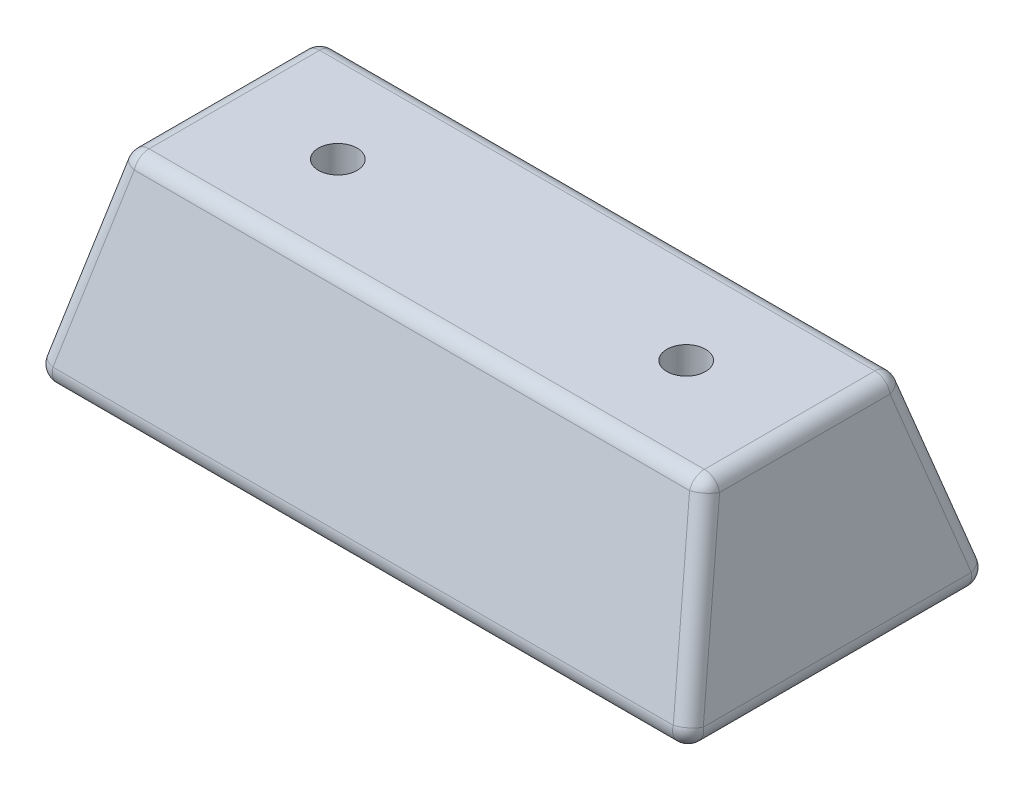
ISO-10303-21;
HEADER;
FILE_DESCRIPTION(('STEP AP214'),'2;1');
FILE_NAME('part.step','',(''),(''),'','','');
FILE_SCHEMA(('AUTOMOTIVE_DESIGN { 1 0 10303 214 1 1 1 1 }'));
ENDSEC;
DATA;
#1=APPLICATION_CONTEXT('core data for automotive mechanical design processes');
#2=APPLICATION_PROTOCOL_DEFINITION('international standard','automotive_design',2000,#1);
#3=PRODUCT_CONTEXT('',#1,'mechanical');
#4=PRODUCT('Part','Part','',(#3));
#5=PRODUCT_RELATED_PRODUCT_CATEGORY('part','',(#4));
#6=PRODUCT_DEFINITION_FORMATION('','',#4);
#7=PRODUCT_DEFINITION_CONTEXT('part definition',#1,'design');
#8=PRODUCT_DEFINITION('design','',#6,#7);
#9=PRODUCT_DEFINITION_SHAPE('','',#8);
#10=(LENGTH_UNIT() NAMED_UNIT(*) SI_UNIT(.MILLI.,.METRE.));
#11=(NAMED_UNIT(*) PLANE_ANGLE_UNIT() SI_UNIT($,.RADIAN.));
#12=(NAMED_UNIT(*) SI_UNIT($,.STERADIAN.) SOLID_ANGLE_UNIT());
#13=UNCERTAINTY_MEASURE_WITH_UNIT(LENGTH_MEASURE(1.E-05),#10,'distance_accuracy_value','');
#14=(GEOMETRIC_REPRESENTATION_CONTEXT(3) GLOBAL_UNCERTAINTY_ASSIGNED_CONTEXT((#13)) GLOBAL_UNIT_ASSIGNED_CONTEXT((#10,
#11,#12)) REPRESENTATION_CONTEXT('',''));
#15=CARTESIAN_POINT('',(0.,0.,0.));
#16=DIRECTION('',(0.,0.,1.));
#17=DIRECTION('',(1.,0.,0.));
#18=AXIS2_PLACEMENT_3D('',#15,#16,#17);
#19=CARTESIAN_POINT('',(0.,31.75,0.));
#20=DIRECTION('',(0.,-1.,0.));
#21=DIRECTION('',(0.,0.,-1.));
#22=AXIS2_PLACEMENT_3D('',#19,#20,#21);
#23=PLANE('',#22);
#24=DIRECTION('',(-1.,0.,0.));
#25=VECTOR('',#24,1.);
#26=CARTESIAN_POINT('',(0.,31.75,-13.9851621467367));
#27=LINE('',#26,#25);
#28=CARTESIAN_POINT('',(45.5426980870948,31.75,-13.9851621467367));
#29=VERTEX_POINT('',#28);
#30=CARTESIAN_POINT('',(-45.5426980870948,31.75,-13.9851621467367));
#31=VERTEX_POINT('',#30);
#32=EDGE_CURVE('E182',#29,#31,#27,.T.);
#33=ORIENTED_EDGE('',*,*,#32,.T.);
#34=DIRECTION('',(0.,0.,1.));
#35=VECTOR('',#34,1.);
#36=CARTESIAN_POINT('',(-45.5426980870948,31.75,0.));
#37=LINE('',#36,#35);
#38=CARTESIAN_POINT('',(-45.5426980870948,31.75,13.9851621467367));
#39=VERTEX_POINT('',#38);
#40=EDGE_CURVE('E184',#31,#39,#37,.T.);
#41=ORIENTED_EDGE('',*,*,#40,.T.);
#42=DIRECTION('',(1.,0.,0.));
#43=VECTOR('',#42,1.);
#44=CARTESIAN_POINT('',(0.,31.75,13.9851621467367));
#45=LINE('',#44,#43);
#46=CARTESIAN_POINT('',(45.5426980870948,31.75,13.9851621467367));
#47=VERTEX_POINT('',#46);
#48=EDGE_CURVE('E178',#39,#47,#45,.T.);
#49=ORIENTED_EDGE('',*,*,#48,.T.);
#50=DIRECTION('',(0.,0.,-1.));
#51=VECTOR('',#50,1.);
#52=CARTESIAN_POINT('',(45.5426980870948,31.75,0.));
#53=LINE('',#52,#51);
#54=EDGE_CURVE('E180',#47,#29,#53,.T.);
#55=ORIENTED_EDGE('',*,*,#54,.T.);
#56=EDGE_LOOP('',(#33,#41,#49,#55));
#57=FACE_BOUND('',#56,.T.);
#58=CARTESIAN_POINT('',(28.575,31.75,0.));
#59=DIRECTION('',(0.,1.,0.));
#60=DIRECTION('',(0.,0.,-1.));
#61=AXIS2_PLACEMENT_3D('',#58,#59,#60);
#62=CIRCLE('',#61,3.175);
#63=CARTESIAN_POINT('',(28.575,31.75,-3.175));
#64=VERTEX_POINT('',#63);
#65=EDGE_CURVE('E264',#64,#64,#62,.T.);
#66=ORIENTED_EDGE('',*,*,#65,.F.);
#67=EDGE_LOOP('',(#66));
#68=FACE_BOUND('',#67,.T.);
#69=CARTESIAN_POINT('',(-28.575,31.75,0.));
#70=DIRECTION('',(0.,1.,0.));
#71=DIRECTION('',(0.,0.,1.));
#72=AXIS2_PLACEMENT_3D('',#69,#70,#71);
#73=CIRCLE('',#72,3.175);
#74=CARTESIAN_POINT('',(-28.575,31.75,3.175));
#75=VERTEX_POINT('',#74);
#76=EDGE_CURVE('E275',#75,#75,#73,.T.);
#77=ORIENTED_EDGE('',*,*,#76,.F.);
#78=EDGE_LOOP('',(#77));
#79=FACE_BOUND('',#78,.T.);
#80=ADVANCED_FACE('F43',(#57,#68,#79),#23,.F.);
#81=CARTESIAN_POINT('',(0.,0.,0.));
#82=DIRECTION('',(0.,-1.,0.));
#83=DIRECTION('',(0.,0.,-1.));
#84=AXIS2_PLACEMENT_3D('',#81,#82,#83);
#85=PLANE('',#84);
#86=DIRECTION('',(1.,0.,0.));
#87=VECTOR('',#86,1.);
#88=CARTESIAN_POINT('',(-53.975,0.,21.9861621467367));
#89=LINE('',#88,#87);
#90=CARTESIAN_POINT('',(50.8766980870948,0.,21.9861621467367));
#91=VERTEX_POINT('',#90);
#92=CARTESIAN_POINT('',(-50.8766980870949,0.,21.9861621467367));
#93=VERTEX_POINT('',#92);
#94=EDGE_CURVE('E168',#91,#93,#89,.F.);
#95=ORIENTED_EDGE('',*,*,#94,.T.);
#96=DIRECTION('',(0.,0.,1.));
#97=VECTOR('',#96,1.);
#98=CARTESIAN_POINT('',(-50.8766980870949,0.,-25.4));
#99=LINE('',#98,#97);
#100=CARTESIAN_POINT('',(-50.8766980870949,0.,-21.9861621467367));
#101=VERTEX_POINT('',#100);
#102=EDGE_CURVE('E139',#93,#101,#99,.F.);
#103=ORIENTED_EDGE('',*,*,#102,.T.);
#104=DIRECTION('',(-1.,0.,0.));
#105=VECTOR('',#104,1.);
#106=CARTESIAN_POINT('',(53.9749999999999,0.,-21.9861621467367));
#107=LINE('',#106,#105);
#108=CARTESIAN_POINT('',(50.8766980870948,0.,-21.9861621467367));
#109=VERTEX_POINT('',#108);
#110=EDGE_CURVE('E175',#101,#109,#107,.F.);
#111=ORIENTED_EDGE('',*,*,#110,.T.);
#112=DIRECTION('',(0.,0.,-1.));
#113=VECTOR('',#112,1.);
#114=CARTESIAN_POINT('',(50.8766980870948,0.,25.4));
#115=LINE('',#114,#113);
#116=EDGE_CURVE('E173',#109,#91,#115,.F.);
#117=ORIENTED_EDGE('',*,*,#116,.T.);
#118=EDGE_LOOP('',(#95,#103,#111,#117));
#119=FACE_BOUND('',#118,.T.);
#120=CARTESIAN_POINT('',(28.575,0.,0.));
#121=DIRECTION('',(0.,-1.,0.));
#122=DIRECTION('',(0.,0.,-1.));
#123=AXIS2_PLACEMENT_3D('',#120,#121,#122);
#124=CIRCLE('',#123,3.175);
#125=CARTESIAN_POINT('',(28.575,0.,-3.175));
#126=VERTEX_POINT('',#125);
#127=EDGE_CURVE('E270',#126,#126,#124,.T.);
#128=ORIENTED_EDGE('',*,*,#127,.F.);
#129=EDGE_LOOP('',(#128));
#130=FACE_BOUND('',#129,.T.);
#131=CARTESIAN_POINT('',(-28.575,0.,0.));
#132=DIRECTION('',(0.,-1.,0.));
#133=DIRECTION('',(0.,0.,-1.));
#134=AXIS2_PLACEMENT_3D('',#131,#132,#133);
#135=CIRCLE('',#134,3.175);
#136=CARTESIAN_POINT('',(-28.575,0.,-3.175));
#137=VERTEX_POINT('',#136);
#138=EDGE_CURVE('E161',#137,#137,#135,.T.);
#139=ORIENTED_EDGE('',*,*,#138,.F.);
#140=EDGE_LOOP('',(#139));
#141=FACE_BOUND('',#140,.T.);
#142=ADVANCED_FACE('F286',(#119,#130,#141),#85,.T.);
#143=CARTESIAN_POINT('',(0.,6.99082568807339,23.302752293578));
#144=DIRECTION('',(0.,-0.287347885566345,-0.957826285221151));
#145=DIRECTION('',(0.,0.957826285221151,-0.287347885566345));
#146=AXIS2_PLACEMENT_3D('',#143,#144,#145);
#147=PLANE('',#146);
#148=DIRECTION('',(0.188144173676719,0.940720868383597,-0.282216260515079));
#149=VECTOR('',#148,1.);
#150=CARTESIAN_POINT('',(-48.3579037045391,15.8638355421173,20.6408493373648));
#151=LINE('',#150,#149);
#152=CARTESIAN_POINT('',(-45.5426980870948,29.9398636293385,16.4180409111984));
#153=VERTEX_POINT('',#152);
#154=CARTESIAN_POINT('',(-50.8766980870948,3.26986362933852,24.4190409111984));
#155=VERTEX_POINT('',#154);
#156=EDGE_CURVE('E52',#153,#155,#151,.F.);
#157=ORIENTED_EDGE('',*,*,#156,.T.);
#158=DIRECTION('',(1.,0.,0.));
#159=VECTOR('',#158,1.);
#160=CARTESIAN_POINT('',(53.9749999999999,3.26986362933852,24.4190409111984));
#161=LINE('',#160,#159);
#162=CARTESIAN_POINT('',(50.8766980870948,3.26986362933852,24.4190409111984));
#163=VERTEX_POINT('',#162);
#164=EDGE_CURVE('E12',#155,#163,#161,.T.);
#165=ORIENTED_EDGE('',*,*,#164,.T.);
#166=DIRECTION('',(-0.188144173676719,0.940720868383597,-0.282216260515079));
#167=VECTOR('',#166,1.);
#168=CARTESIAN_POINT('',(48.3579037045391,15.8638355421172,20.6408493373648));
#169=LINE('',#168,#167);
#170=CARTESIAN_POINT('',(45.5426980870948,29.9398636293385,16.4180409111984));
#171=VERTEX_POINT('',#170);
#172=EDGE_CURVE('E205',#163,#171,#169,.T.);
#173=ORIENTED_EDGE('',*,*,#172,.T.);
#174=DIRECTION('',(1.,0.,0.));
#175=VECTOR('',#174,1.);
#176=CARTESIAN_POINT('',(0.,29.9398636293385,16.4180409111984));
#177=LINE('',#176,#175);
#178=EDGE_CURVE('E63',#171,#153,#177,.F.);
#179=ORIENTED_EDGE('',*,*,#178,.T.);
#180=EDGE_LOOP('',(#157,#165,#173,#179));
#181=FACE_BOUND('',#180,.T.);
#182=ADVANCED_FACE('F288',(#181),#147,.F.);
#183=CARTESIAN_POINT('',(-51.8990384615384,10.3798076923077,0.));
#184=DIRECTION('',(0.98058067569092,-0.196116135138184,0.));
#185=DIRECTION('',(0.196116135138184,0.98058067569092,0.));
#186=AXIS2_PLACEMENT_3D('',#183,#184,#185);
#187=PLANE('',#186);
#188=DIRECTION('',(0.,0.,1.));
#189=VECTOR('',#188,1.);
#190=CARTESIAN_POINT('',(-48.0333730033498,29.708134983251,0.));
#191=LINE('',#190,#189);
#192=CARTESIAN_POINT('',(-48.0333730033498,29.708134983251,13.9851621467367));
#193=VERTEX_POINT('',#192);
#194=CARTESIAN_POINT('',(-48.0333730033498,29.708134983251,-13.9851621467367));
#195=VERTEX_POINT('',#194);
#196=EDGE_CURVE('E160',#193,#195,#191,.F.);
#197=ORIENTED_EDGE('',*,*,#196,.T.);
#198=DIRECTION('',(0.188144173676719,0.940720868383597,0.282216260515079));
#199=VECTOR('',#198,1.);
#200=CARTESIAN_POINT('',(-50.848578620794,15.6321068960297,-18.2079705729031));
#201=LINE('',#200,#199);
#202=CARTESIAN_POINT('',(-53.3673730033498,3.03813498325099,-21.9861621467367));
#203=VERTEX_POINT('',#202);
#204=EDGE_CURVE('E165',#195,#203,#201,.F.);
#205=ORIENTED_EDGE('',*,*,#204,.T.);
#206=DIRECTION('',(0.,0.,1.));
#207=VECTOR('',#206,1.);
#208=CARTESIAN_POINT('',(-53.3673730033498,3.03813498325099,25.4));
#209=LINE('',#208,#207);
#210=CARTESIAN_POINT('',(-53.3673730033498,3.03813498325099,21.9861621467367));
#211=VERTEX_POINT('',#210);
#212=EDGE_CURVE('E137',#203,#211,#209,.T.);
#213=ORIENTED_EDGE('',*,*,#212,.T.);
#214=DIRECTION('',(0.188144173676719,0.940720868383597,-0.282216260515079));
#215=VECTOR('',#214,1.);
#216=CARTESIAN_POINT('',(-50.848578620794,15.6321068960297,18.2079705729031));
#217=LINE('',#216,#215);
#218=EDGE_CURVE('E154',#211,#193,#217,.T.);
#219=ORIENTED_EDGE('',*,*,#218,.T.);
#220=EDGE_LOOP('',(#197,#205,#213,#219));
#221=FACE_BOUND('',#220,.T.);
#222=ADVANCED_FACE('F163',(#221),#187,.F.);
#223=CARTESIAN_POINT('',(51.8990384615384,10.3798076923077,0.));
#224=DIRECTION('',(-0.98058067569092,-0.196116135138183,0.));
#225=DIRECTION('',(0.196116135138183,-0.98058067569092,0.));
#226=AXIS2_PLACEMENT_3D('',#223,#224,#225);
#227=PLANE('',#226);
#228=DIRECTION('',(0.,0.,-1.));
#229=VECTOR('',#228,1.);
#230=CARTESIAN_POINT('',(53.3673730033498,3.03813498325099,-25.4));
#231=LINE('',#230,#229);
#232=CARTESIAN_POINT('',(53.3673730033498,3.03813498325099,21.9861621467367));
#233=VERTEX_POINT('',#232);
#234=CARTESIAN_POINT('',(53.3673730033498,3.03813498325099,-21.9861621467367));
#235=VERTEX_POINT('',#234);
#236=EDGE_CURVE('E200',#233,#235,#231,.T.);
#237=ORIENTED_EDGE('',*,*,#236,.T.);
#238=DIRECTION('',(-0.188144173676719,0.940720868383597,0.282216260515079));
#239=VECTOR('',#238,1.);
#240=CARTESIAN_POINT('',(50.848578620794,15.6321068960297,-18.2079705729031));
#241=LINE('',#240,#239);
#242=CARTESIAN_POINT('',(48.0333730033498,29.708134983251,-13.9851621467367));
#243=VERTEX_POINT('',#242);
#244=EDGE_CURVE('E203',#235,#243,#241,.T.);
#245=ORIENTED_EDGE('',*,*,#244,.T.);
#246=DIRECTION('',(0.,0.,-1.));
#247=VECTOR('',#246,1.);
#248=CARTESIAN_POINT('',(48.0333730033498,29.708134983251,0.));
#249=LINE('',#248,#247);
#250=CARTESIAN_POINT('',(48.0333730033498,29.708134983251,13.9851621467367));
#251=VERTEX_POINT('',#250);
#252=EDGE_CURVE('E198',#243,#251,#249,.F.);
#253=ORIENTED_EDGE('',*,*,#252,.T.);
#254=DIRECTION('',(-0.188144173676719,0.940720868383597,-0.282216260515079));
#255=VECTOR('',#254,1.);
#256=CARTESIAN_POINT('',(50.848578620794,15.6321068960297,18.2079705729031));
#257=LINE('',#256,#255);
#258=EDGE_CURVE('E196',#251,#233,#257,.F.);
#259=ORIENTED_EDGE('',*,*,#258,.T.);
#260=EDGE_LOOP('',(#237,#245,#253,#259));
#261=FACE_BOUND('',#260,.T.);
#262=ADVANCED_FACE('F304',(#261),#227,.F.);
#263=CARTESIAN_POINT('',(0.,6.99082568807339,-23.302752293578));
#264=DIRECTION('',(0.,-0.287347885566345,0.957826285221151));
#265=DIRECTION('',(0.,-0.957826285221151,-0.287347885566345));
#266=AXIS2_PLACEMENT_3D('',#263,#264,#265);
#267=PLANE('',#266);
#268=DIRECTION('',(-1.,0.,0.));
#269=VECTOR('',#268,1.);
#270=CARTESIAN_POINT('',(-53.975,3.26986362933852,-24.4190409111984));
#271=LINE('',#270,#269);
#272=CARTESIAN_POINT('',(50.8766980870948,3.26986362933852,-24.4190409111984));
#273=VERTEX_POINT('',#272);
#274=CARTESIAN_POINT('',(-50.8766980870948,3.26986362933852,-24.4190409111984));
#275=VERTEX_POINT('',#274);
#276=EDGE_CURVE('E191',#273,#275,#271,.T.);
#277=ORIENTED_EDGE('',*,*,#276,.T.);
#278=DIRECTION('',(0.188144173676719,0.940720868383597,0.282216260515079));
#279=VECTOR('',#278,1.);
#280=CARTESIAN_POINT('',(-48.3579037045391,15.8638355421173,-20.6408493373648));
#281=LINE('',#280,#279);
#282=CARTESIAN_POINT('',(-45.5426980870948,29.9398636293385,-16.4180409111984));
#283=VERTEX_POINT('',#282);
#284=EDGE_CURVE('E194',#275,#283,#281,.T.);
#285=ORIENTED_EDGE('',*,*,#284,.T.);
#286=DIRECTION('',(-1.,0.,0.));
#287=VECTOR('',#286,1.);
#288=CARTESIAN_POINT('',(0.,29.9398636293385,-16.4180409111984));
#289=LINE('',#288,#287);
#290=CARTESIAN_POINT('',(45.5426980870949,29.9398636293385,-16.4180409111984));
#291=VERTEX_POINT('',#290);
#292=EDGE_CURVE('E189',#283,#291,#289,.F.);
#293=ORIENTED_EDGE('',*,*,#292,.T.);
#294=DIRECTION('',(-0.188144173676719,0.940720868383597,0.282216260515079));
#295=VECTOR('',#294,1.);
#296=CARTESIAN_POINT('',(48.3579037045391,15.8638355421172,-20.6408493373648));
#297=LINE('',#296,#295);
#298=EDGE_CURVE('E187',#291,#273,#297,.F.);
#299=ORIENTED_EDGE('',*,*,#298,.T.);
#300=EDGE_LOOP('',(#277,#285,#293,#299));
#301=FACE_BOUND('',#300,.T.);
#302=ADVANCED_FACE('F307',(#301),#267,.F.);
#303=CARTESIAN_POINT('',(-28.575,-0.000100000000009814,0.));
#304=DIRECTION('',(0.,1.,0.));
#305=DIRECTION('',(0.,0.,1.));
#306=AXIS2_PLACEMENT_3D('',#303,#304,#305);
#307=CYLINDRICAL_SURFACE('',#306,3.175);
#308=ORIENTED_EDGE('',*,*,#138,.T.);
#309=EDGE_LOOP('',(#308));
#310=FACE_BOUND('',#309,.T.);
#311=ORIENTED_EDGE('',*,*,#76,.T.);
#312=EDGE_LOOP('',(#311));
#313=FACE_BOUND('',#312,.T.);
#314=ADVANCED_FACE('F283',(#310,#313),#307,.F.);
#315=CARTESIAN_POINT('',(28.575,-0.000100000000009814,0.));
#316=DIRECTION('',(0.,1.,0.));
#317=DIRECTION('',(0.,0.,1.));
#318=AXIS2_PLACEMENT_3D('',#315,#316,#317);
#319=CYLINDRICAL_SURFACE('',#318,3.175);
#320=ORIENTED_EDGE('',*,*,#127,.T.);
#321=EDGE_LOOP('',(#320));
#322=FACE_BOUND('',#321,.T.);
#323=ORIENTED_EDGE('',*,*,#65,.T.);
#324=EDGE_LOOP('',(#323));
#325=FACE_BOUND('',#324,.T.);
#326=ADVANCED_FACE('F381',(#322,#325),#319,.F.);
#327=CARTESIAN_POINT('',(45.5426980870948,29.21,0.));
#328=DIRECTION('',(0.,0.,-1.));
#329=DIRECTION('',(-1.,0.,0.));
#330=AXIS2_PLACEMENT_3D('',#327,#328,#329);
#331=CYLINDRICAL_SURFACE('',#330,2.54);
#332=CARTESIAN_POINT('',(45.5426980870948,29.21,-13.9851621467367));
#333=DIRECTION('',(0.,0.,-1.));
#334=DIRECTION('',(-1.,0.,0.));
#335=AXIS2_PLACEMENT_3D('',#332,#333,#334);
#336=CIRCLE('',#335,2.54);
#337=EDGE_CURVE('E47',#29,#243,#336,.T.);
#338=ORIENTED_EDGE('',*,*,#337,.F.);
#339=ORIENTED_EDGE('',*,*,#54,.F.);
#340=CARTESIAN_POINT('',(45.5426980870949,29.21,13.9851621467367));
#341=DIRECTION('',(0.,0.,1.));
#342=DIRECTION('',(0.,-1.,0.));
#343=AXIS2_PLACEMENT_3D('',#340,#341,#342);
#344=CIRCLE('',#343,2.54);
#345=EDGE_CURVE('E257',#251,#47,#344,.T.);
#346=ORIENTED_EDGE('',*,*,#345,.F.);
#347=ORIENTED_EDGE('',*,*,#252,.F.);
#348=EDGE_LOOP('',(#338,#339,#346,#347));
#349=FACE_BOUND('',#348,.T.);
#350=ADVANCED_FACE('F45',(#349),#331,.T.);
#351=CARTESIAN_POINT('',(45.5426980870949,29.21,-13.9851621467367));
#352=DIRECTION('',(0.,0.,1.));
#353=DIRECTION('',(1.,0.,0.));
#354=AXIS2_PLACEMENT_3D('',#351,#352,#353);
#355=SPHERICAL_SURFACE('',#354,2.54);
#356=CARTESIAN_POINT('',(45.5426980870949,29.21,-13.9851621467367));
#357=DIRECTION('',(1.,0.,0.));
#358=DIRECTION('',(0.,1.,0.));
#359=AXIS2_PLACEMENT_3D('',#356,#357,#358);
#360=CIRCLE('',#359,2.54);
#361=EDGE_CURVE('E252',#29,#291,#360,.F.);
#362=ORIENTED_EDGE('',*,*,#361,.F.);
#363=ORIENTED_EDGE('',*,*,#337,.T.);
#364=CARTESIAN_POINT('',(45.5426980870949,29.21,-13.9851621467367));
#365=DIRECTION('',(-0.188144173676719,0.940720868383598,0.282216260515077));
#366=DIRECTION('',(0.,-0.287347885566344,0.957826285221152));
#367=AXIS2_PLACEMENT_3D('',#364,#365,#366);
#368=CIRCLE('',#367,2.54);
#369=EDGE_CURVE('E255',#291,#243,#368,.F.);
#370=ORIENTED_EDGE('',*,*,#369,.F.);
#371=EDGE_LOOP('',(#362,#363,#370));
#372=FACE_BOUND('',#371,.T.);
#373=ADVANCED_FACE('F376',(#372),#355,.T.);
#374=CARTESIAN_POINT('',(45.5426980870949,29.21,13.9851621467367));
#375=DIRECTION('',(0.,0.,1.));
#376=DIRECTION('',(1.,0.,0.));
#377=AXIS2_PLACEMENT_3D('',#374,#375,#376);
#378=SPHERICAL_SURFACE('',#377,2.54);
#379=CARTESIAN_POINT('',(45.5426980870948,29.21,13.9851621467367));
#380=DIRECTION('',(-0.188144173676719,0.940720868383597,-0.282216260515079));
#381=DIRECTION('',(0.,0.287347885566345,0.957826285221151));
#382=AXIS2_PLACEMENT_3D('',#379,#380,#381);
#383=CIRCLE('',#382,2.54);
#384=EDGE_CURVE('E246',#251,#171,#383,.F.);
#385=ORIENTED_EDGE('',*,*,#384,.F.);
#386=ORIENTED_EDGE('',*,*,#345,.T.);
#387=CARTESIAN_POINT('',(45.5426980870948,29.21,13.9851621467367));
#388=DIRECTION('',(1.,0.,0.));
#389=DIRECTION('',(0.,0.,-1.));
#390=AXIS2_PLACEMENT_3D('',#387,#388,#389);
#391=CIRCLE('',#390,2.54);
#392=EDGE_CURVE('E249',#171,#47,#391,.F.);
#393=ORIENTED_EDGE('',*,*,#392,.F.);
#394=EDGE_LOOP('',(#385,#386,#393));
#395=FACE_BOUND('',#394,.T.);
#396=ADVANCED_FACE('F373',(#395),#378,.T.);
#397=CARTESIAN_POINT('',(48.3579037045391,15.1339719127787,-18.2079705729031));
#398=DIRECTION('',(-0.188144173676719,0.940720868383597,0.282216260515079));
#399=DIRECTION('',(0.,-0.287347885566345,0.957826285221151));
#400=AXIS2_PLACEMENT_3D('',#397,#398,#399);
#401=CYLINDRICAL_SURFACE('',#400,2.54);
#402=ORIENTED_EDGE('',*,*,#369,.T.);
#403=ORIENTED_EDGE('',*,*,#244,.F.);
#404=CARTESIAN_POINT('',(50.8766980870948,2.54,-21.9861621467367));
#405=DIRECTION('',(0.18814417367672,-0.940720868383597,-0.282216260515079));
#406=DIRECTION('',(0.,0.287347885566345,-0.957826285221151));
#407=AXIS2_PLACEMENT_3D('',#404,#405,#406);
#408=CIRCLE('',#407,2.54);
#409=EDGE_CURVE('E241',#273,#235,#408,.T.);
#410=ORIENTED_EDGE('',*,*,#409,.F.);
#411=ORIENTED_EDGE('',*,*,#298,.F.);
#412=EDGE_LOOP('',(#402,#403,#410,#411));
#413=FACE_BOUND('',#412,.T.);
#414=ADVANCED_FACE('F369',(#413),#401,.T.);
#415=CARTESIAN_POINT('',(0.,29.21,-13.9851621467367));
#416=DIRECTION('',(-1.,0.,0.));
#417=DIRECTION('',(0.,0.,1.));
#418=AXIS2_PLACEMENT_3D('',#415,#416,#417);
#419=CYLINDRICAL_SURFACE('',#418,2.54);
#420=ORIENTED_EDGE('',*,*,#361,.T.);
#421=ORIENTED_EDGE('',*,*,#292,.F.);
#422=CARTESIAN_POINT('',(-45.5426980870948,29.21,-13.9851621467367));
#423=DIRECTION('',(-1.,0.,0.));
#424=DIRECTION('',(0.,0.,1.));
#425=AXIS2_PLACEMENT_3D('',#422,#423,#424);
#426=CIRCLE('',#425,2.54);
#427=EDGE_CURVE('E238',#31,#283,#426,.T.);
#428=ORIENTED_EDGE('',*,*,#427,.F.);
#429=ORIENTED_EDGE('',*,*,#32,.F.);
#430=EDGE_LOOP('',(#420,#421,#428,#429));
#431=FACE_BOUND('',#430,.T.);
#432=ADVANCED_FACE('F365',(#431),#419,.T.);
#433=CARTESIAN_POINT('',(-45.5426980870948,29.21,0.));
#434=DIRECTION('',(0.,0.,1.));
#435=DIRECTION('',(1.,0.,0.));
#436=AXIS2_PLACEMENT_3D('',#433,#434,#435);
#437=CYLINDRICAL_SURFACE('',#436,2.54);
#438=CARTESIAN_POINT('',(-45.5426980870948,29.21,13.9851621467367));
#439=DIRECTION('',(0.,0.,1.));
#440=DIRECTION('',(1.,0.,0.));
#441=AXIS2_PLACEMENT_3D('',#438,#439,#440);
#442=CIRCLE('',#441,2.54);
#443=EDGE_CURVE('E232',#39,#193,#442,.T.);
#444=ORIENTED_EDGE('',*,*,#443,.F.);
#445=ORIENTED_EDGE('',*,*,#40,.F.);
#446=CARTESIAN_POINT('',(-45.5426980870948,29.21,-13.9851621467367));
#447=DIRECTION('',(0.,0.,-1.));
#448=DIRECTION('',(0.,1.,0.));
#449=AXIS2_PLACEMENT_3D('',#446,#447,#448);
#450=CIRCLE('',#449,2.54);
#451=EDGE_CURVE('E235',#195,#31,#450,.T.);
#452=ORIENTED_EDGE('',*,*,#451,.F.);
#453=ORIENTED_EDGE('',*,*,#196,.F.);
#454=EDGE_LOOP('',(#444,#445,#452,#453));
#455=FACE_BOUND('',#454,.T.);
#456=ADVANCED_FACE('F361',(#455),#437,.T.);
#457=CARTESIAN_POINT('',(0.,29.21,13.9851621467367));
#458=DIRECTION('',(1.,0.,0.));
#459=DIRECTION('',(0.,0.,-1.));
#460=AXIS2_PLACEMENT_3D('',#457,#458,#459);
#461=CYLINDRICAL_SURFACE('',#460,2.54);
#462=ORIENTED_EDGE('',*,*,#392,.T.);
#463=ORIENTED_EDGE('',*,*,#48,.F.);
#464=CARTESIAN_POINT('',(-45.5426980870948,29.21,13.9851621467367));
#465=DIRECTION('',(-1.,0.,0.));
#466=DIRECTION('',(0.,0.,1.));
#467=AXIS2_PLACEMENT_3D('',#464,#465,#466);
#468=CIRCLE('',#467,2.54);
#469=EDGE_CURVE('E230',#153,#39,#468,.T.);
#470=ORIENTED_EDGE('',*,*,#469,.F.);
#471=ORIENTED_EDGE('',*,*,#178,.F.);
#472=EDGE_LOOP('',(#462,#463,#470,#471));
#473=FACE_BOUND('',#472,.T.);
#474=ADVANCED_FACE('F357',(#473),#461,.T.);
#475=CARTESIAN_POINT('',(48.3579037045391,15.1339719127787,18.2079705729031));
#476=DIRECTION('',(-0.188144173676719,0.940720868383597,-0.282216260515079));
#477=DIRECTION('',(0.,0.287347885566345,0.957826285221151));
#478=AXIS2_PLACEMENT_3D('',#475,#476,#477);
#479=CYLINDRICAL_SURFACE('',#478,2.54);
#480=ORIENTED_EDGE('',*,*,#384,.T.);
#481=ORIENTED_EDGE('',*,*,#172,.F.);
#482=CARTESIAN_POINT('',(50.8766980870948,2.54,21.9861621467367));
#483=DIRECTION('',(0.188144173676719,-0.940720868383598,0.282216260515079));
#484=DIRECTION('',(0.,-0.287347885566345,-0.957826285221151));
#485=AXIS2_PLACEMENT_3D('',#482,#483,#484);
#486=CIRCLE('',#485,2.54);
#487=EDGE_CURVE('E227',#233,#163,#486,.T.);
#488=ORIENTED_EDGE('',*,*,#487,.F.);
#489=ORIENTED_EDGE('',*,*,#258,.F.);
#490=EDGE_LOOP('',(#480,#481,#488,#489));
#491=FACE_BOUND('',#490,.T.);
#492=ADVANCED_FACE('F353',(#491),#479,.T.);
#493=CARTESIAN_POINT('',(50.8766980870948,2.54,0.));
#494=DIRECTION('',(0.,0.,1.));
#495=DIRECTION('',(1.,0.,0.));
#496=AXIS2_PLACEMENT_3D('',#493,#494,#495);
#497=CYLINDRICAL_SURFACE('',#496,2.54);
#498=CARTESIAN_POINT('',(50.8766980870948,2.54,-21.9861621467367));
#499=DIRECTION('',(0.,0.,-1.));
#500=DIRECTION('',(0.,1.,0.));
#501=AXIS2_PLACEMENT_3D('',#498,#499,#500);
#502=CIRCLE('',#501,2.54);
#503=EDGE_CURVE('E243',#235,#109,#502,.T.);
#504=ORIENTED_EDGE('',*,*,#503,.F.);
#505=ORIENTED_EDGE('',*,*,#236,.F.);
#506=CARTESIAN_POINT('',(50.8766980870948,2.54,21.9861621467367));
#507=DIRECTION('',(0.,0.,1.));
#508=DIRECTION('',(1.,0.,0.));
#509=AXIS2_PLACEMENT_3D('',#506,#507,#508);
#510=CIRCLE('',#509,2.54);
#511=EDGE_CURVE('E224',#91,#233,#510,.T.);
#512=ORIENTED_EDGE('',*,*,#511,.F.);
#513=ORIENTED_EDGE('',*,*,#116,.F.);
#514=EDGE_LOOP('',(#504,#505,#512,#513));
#515=FACE_BOUND('',#514,.T.);
#516=ADVANCED_FACE('F349',(#515),#497,.T.);
#517=CARTESIAN_POINT('',(50.8766980870948,2.54,-21.9861621467367));
#518=DIRECTION('',(0.,0.,1.));
#519=DIRECTION('',(1.,0.,0.));
#520=AXIS2_PLACEMENT_3D('',#517,#518,#519);
#521=SPHERICAL_SURFACE('',#520,2.54);
#522=ORIENTED_EDGE('',*,*,#409,.T.);
#523=ORIENTED_EDGE('',*,*,#503,.T.);
#524=CARTESIAN_POINT('',(50.8766980870948,2.54,-21.9861621467367));
#525=DIRECTION('',(1.,0.,0.));
#526=DIRECTION('',(0.,0.,-1.));
#527=AXIS2_PLACEMENT_3D('',#524,#525,#526);
#528=CIRCLE('',#527,2.54);
#529=EDGE_CURVE('E221',#273,#109,#528,.F.);
#530=ORIENTED_EDGE('',*,*,#529,.F.);
#531=EDGE_LOOP('',(#522,#523,#530));
#532=FACE_BOUND('',#531,.T.);
#533=ADVANCED_FACE('F345',(#532),#521,.T.);
#534=CARTESIAN_POINT('',(-45.5426980870948,29.21,-13.9851621467367));
#535=DIRECTION('',(0.,0.,1.));
#536=DIRECTION('',(1.,0.,0.));
#537=AXIS2_PLACEMENT_3D('',#534,#535,#536);
#538=SPHERICAL_SURFACE('',#537,2.54);
#539=ORIENTED_EDGE('',*,*,#451,.T.);
#540=ORIENTED_EDGE('',*,*,#427,.T.);
#541=CARTESIAN_POINT('',(-45.5426980870948,29.21,-13.9851621467367));
#542=DIRECTION('',(0.188144173676718,0.940720868383598,0.282216260515079));
#543=DIRECTION('',(0.,-0.287347885566345,0.957826285221151));
#544=AXIS2_PLACEMENT_3D('',#541,#542,#543);
#545=CIRCLE('',#544,2.54);
#546=EDGE_CURVE('E218',#195,#283,#545,.F.);
#547=ORIENTED_EDGE('',*,*,#546,.F.);
#548=EDGE_LOOP('',(#539,#540,#547));
#549=FACE_BOUND('',#548,.T.);
#550=ADVANCED_FACE('F341',(#549),#538,.T.);
#551=CARTESIAN_POINT('',(-45.5426980870948,29.21,13.9851621467367));
#552=DIRECTION('',(0.,0.,1.));
#553=DIRECTION('',(1.,0.,0.));
#554=AXIS2_PLACEMENT_3D('',#551,#552,#553);
#555=SPHERICAL_SURFACE('',#554,2.54);
#556=ORIENTED_EDGE('',*,*,#469,.T.);
#557=ORIENTED_EDGE('',*,*,#443,.T.);
#558=CARTESIAN_POINT('',(-45.5426980870948,29.21,13.9851621467367));
#559=DIRECTION('',(0.18814417367672,0.940720868383597,-0.282216260515079));
#560=DIRECTION('',(0.,0.287347885566345,0.957826285221151));
#561=AXIS2_PLACEMENT_3D('',#558,#559,#560);
#562=CIRCLE('',#561,2.54);
#563=EDGE_CURVE('E157',#153,#193,#562,.F.);
#564=ORIENTED_EDGE('',*,*,#563,.F.);
#565=EDGE_LOOP('',(#556,#557,#564));
#566=FACE_BOUND('',#565,.T.);
#567=ADVANCED_FACE('F337',(#566),#555,.T.);
#568=CARTESIAN_POINT('',(50.8766980870948,2.54,21.9861621467367));
#569=DIRECTION('',(0.,0.,1.));
#570=DIRECTION('',(1.,0.,0.));
#571=AXIS2_PLACEMENT_3D('',#568,#569,#570);
#572=SPHERICAL_SURFACE('',#571,2.54);
#573=ORIENTED_EDGE('',*,*,#511,.T.);
#574=ORIENTED_EDGE('',*,*,#487,.T.);
#575=CARTESIAN_POINT('',(50.8766980870948,2.54,21.9861621467367));
#576=DIRECTION('',(1.,0.,0.));
#577=DIRECTION('',(0.,0.,-1.));
#578=AXIS2_PLACEMENT_3D('',#575,#576,#577);
#579=CIRCLE('',#578,2.54);
#580=EDGE_CURVE('E215',#91,#163,#579,.F.);
#581=ORIENTED_EDGE('',*,*,#580,.F.);
#582=EDGE_LOOP('',(#573,#574,#581));
#583=FACE_BOUND('',#582,.T.);
#584=ADVANCED_FACE('F333',(#583),#572,.T.);
#585=CARTESIAN_POINT('',(0.,2.54,-21.9861621467367));
#586=DIRECTION('',(1.,0.,0.));
#587=DIRECTION('',(0.,0.,-1.));
#588=AXIS2_PLACEMENT_3D('',#585,#586,#587);
#589=CYLINDRICAL_SURFACE('',#588,2.54);
#590=ORIENTED_EDGE('',*,*,#529,.T.);
#591=ORIENTED_EDGE('',*,*,#110,.F.);
#592=CARTESIAN_POINT('',(-50.8766980870948,2.54,-21.9861621467367));
#593=DIRECTION('',(-1.,0.,0.));
#594=DIRECTION('',(0.,-1.,0.));
#595=AXIS2_PLACEMENT_3D('',#592,#593,#594);
#596=CIRCLE('',#595,2.54);
#597=EDGE_CURVE('E212',#275,#101,#596,.T.);
#598=ORIENTED_EDGE('',*,*,#597,.F.);
#599=ORIENTED_EDGE('',*,*,#276,.F.);
#600=EDGE_LOOP('',(#590,#591,#598,#599));
#601=FACE_BOUND('',#600,.T.);
#602=ADVANCED_FACE('F329',(#601),#589,.T.);
#603=CARTESIAN_POINT('',(-48.3579037045391,15.1339719127787,-18.2079705729031));
#604=DIRECTION('',(0.188144173676719,0.940720868383597,0.282216260515079));
#605=DIRECTION('',(0.,-0.287347885566345,0.957826285221151));
#606=AXIS2_PLACEMENT_3D('',#603,#604,#605);
#607=CYLINDRICAL_SURFACE('',#606,2.54);
#608=ORIENTED_EDGE('',*,*,#546,.T.);
#609=ORIENTED_EDGE('',*,*,#284,.F.);
#610=CARTESIAN_POINT('',(-50.8766980870949,2.54,-21.9861621467367));
#611=DIRECTION('',(-0.188144173676719,-0.940720868383597,-0.282216260515081));
#612=DIRECTION('',(0.,0.287347885566347,-0.957826285221151));
#613=AXIS2_PLACEMENT_3D('',#610,#611,#612);
#614=CIRCLE('',#613,2.54);
#615=EDGE_CURVE('E151',#203,#275,#614,.T.);
#616=ORIENTED_EDGE('',*,*,#615,.F.);
#617=ORIENTED_EDGE('',*,*,#204,.F.);
#618=EDGE_LOOP('',(#608,#609,#616,#617));
#619=FACE_BOUND('',#618,.T.);
#620=ADVANCED_FACE('F326',(#619),#607,.T.);
#621=CARTESIAN_POINT('',(-48.3579037045391,15.1339719127787,18.2079705729031));
#622=DIRECTION('',(0.188144173676719,0.940720868383597,-0.282216260515079));
#623=DIRECTION('',(0.,0.287347885566345,0.957826285221151));
#624=AXIS2_PLACEMENT_3D('',#621,#622,#623);
#625=CYLINDRICAL_SURFACE('',#624,2.54);
#626=ORIENTED_EDGE('',*,*,#563,.T.);
#627=ORIENTED_EDGE('',*,*,#218,.F.);
#628=CARTESIAN_POINT('',(-50.8766980870948,2.54,21.9861621467367));
#629=DIRECTION('',(-0.188144173676718,-0.940720868383598,0.282216260515079));
#630=DIRECTION('',(0.,-0.287347885566345,-0.957826285221151));
#631=AXIS2_PLACEMENT_3D('',#628,#629,#630);
#632=CIRCLE('',#631,2.54);
#633=EDGE_CURVE('E145',#155,#211,#632,.T.);
#634=ORIENTED_EDGE('',*,*,#633,.F.);
#635=ORIENTED_EDGE('',*,*,#156,.F.);
#636=EDGE_LOOP('',(#626,#627,#634,#635));
#637=FACE_BOUND('',#636,.T.);
#638=ADVANCED_FACE('F155',(#637),#625,.T.);
#639=CARTESIAN_POINT('',(0.,2.54,21.9861621467367));
#640=DIRECTION('',(-1.,0.,0.));
#641=DIRECTION('',(0.,0.,1.));
#642=AXIS2_PLACEMENT_3D('',#639,#640,#641);
#643=CYLINDRICAL_SURFACE('',#642,2.54);
#644=ORIENTED_EDGE('',*,*,#580,.T.);
#645=ORIENTED_EDGE('',*,*,#164,.F.);
#646=CARTESIAN_POINT('',(-50.8766980870949,2.54,21.9861621467367));
#647=DIRECTION('',(-1.,0.,0.));
#648=DIRECTION('',(0.,0.,1.));
#649=AXIS2_PLACEMENT_3D('',#646,#647,#648);
#650=CIRCLE('',#649,2.54);
#651=EDGE_CURVE('E149',#93,#155,#650,.T.);
#652=ORIENTED_EDGE('',*,*,#651,.F.);
#653=ORIENTED_EDGE('',*,*,#94,.F.);
#654=EDGE_LOOP('',(#644,#645,#652,#653));
#655=FACE_BOUND('',#654,.T.);
#656=ADVANCED_FACE('F319',(#655),#643,.T.);
#657=CARTESIAN_POINT('',(-50.8766980870949,2.54,-21.9861621467367));
#658=DIRECTION('',(0.,0.,1.));
#659=DIRECTION('',(1.,0.,0.));
#660=AXIS2_PLACEMENT_3D('',#657,#658,#659);
#661=SPHERICAL_SURFACE('',#660,2.54);
#662=ORIENTED_EDGE('',*,*,#615,.T.);
#663=ORIENTED_EDGE('',*,*,#597,.T.);
#664=CARTESIAN_POINT('',(-50.8766980870949,2.54,-21.9861621467367));
#665=DIRECTION('',(0.,0.,-1.));
#666=DIRECTION('',(-1.,0.,0.));
#667=AXIS2_PLACEMENT_3D('',#664,#665,#666);
#668=CIRCLE('',#667,2.54);
#669=EDGE_CURVE('E142',#203,#101,#668,.F.);
#670=ORIENTED_EDGE('',*,*,#669,.F.);
#671=EDGE_LOOP('',(#662,#663,#670));
#672=FACE_BOUND('',#671,.T.);
#673=ADVANCED_FACE('F316',(#672),#661,.T.);
#674=CARTESIAN_POINT('',(-50.8766980870949,2.54,21.9861621467367));
#675=DIRECTION('',(0.,0.,1.));
#676=DIRECTION('',(1.,0.,0.));
#677=AXIS2_PLACEMENT_3D('',#674,#675,#676);
#678=SPHERICAL_SURFACE('',#677,2.54);
#679=ORIENTED_EDGE('',*,*,#651,.T.);
#680=ORIENTED_EDGE('',*,*,#633,.T.);
#681=CARTESIAN_POINT('',(-50.8766980870949,2.54,21.9861621467367));
#682=DIRECTION('',(0.,0.,1.));
#683=DIRECTION('',(0.,-1.,0.));
#684=AXIS2_PLACEMENT_3D('',#681,#682,#683);
#685=CIRCLE('',#684,2.54);
#686=EDGE_CURVE('E133',#93,#211,#685,.F.);
#687=ORIENTED_EDGE('',*,*,#686,.F.);
#688=EDGE_LOOP('',(#679,#680,#687));
#689=FACE_BOUND('',#688,.T.);
#690=ADVANCED_FACE('F147',(#689),#678,.T.);
#691=CARTESIAN_POINT('',(-50.8766980870949,2.54,0.));
#692=DIRECTION('',(0.,0.,-1.));
#693=DIRECTION('',(-1.,0.,0.));
#694=AXIS2_PLACEMENT_3D('',#691,#692,#693);
#695=CYLINDRICAL_SURFACE('',#694,2.54);
#696=ORIENTED_EDGE('',*,*,#669,.T.);
#697=ORIENTED_EDGE('',*,*,#102,.F.);
#698=ORIENTED_EDGE('',*,*,#686,.T.);
#699=ORIENTED_EDGE('',*,*,#212,.F.);
#700=EDGE_LOOP('',(#696,#697,#698,#699));
#701=FACE_BOUND('',#700,.T.);
#702=ADVANCED_FACE('F135',(#701),#695,.T.);
#703=CLOSED_SHELL('',(#80,#142,#182,#222,#262,#302,#314,#326,#350,#373,#396,#414,#432,#456,#474,
#492,#516,#533,#550,#567,#584,#602,#620,#638,#656,#673,#690,#702));
#704=MANIFOLD_SOLID_BREP('B2',#703);
#705=ADVANCED_BREP_SHAPE_REPRESENTATION('',(#18,#704),#14);
#706=SHAPE_DEFINITION_REPRESENTATION(#9,#705);
ENDSEC;
END-ISO-10303-21;
